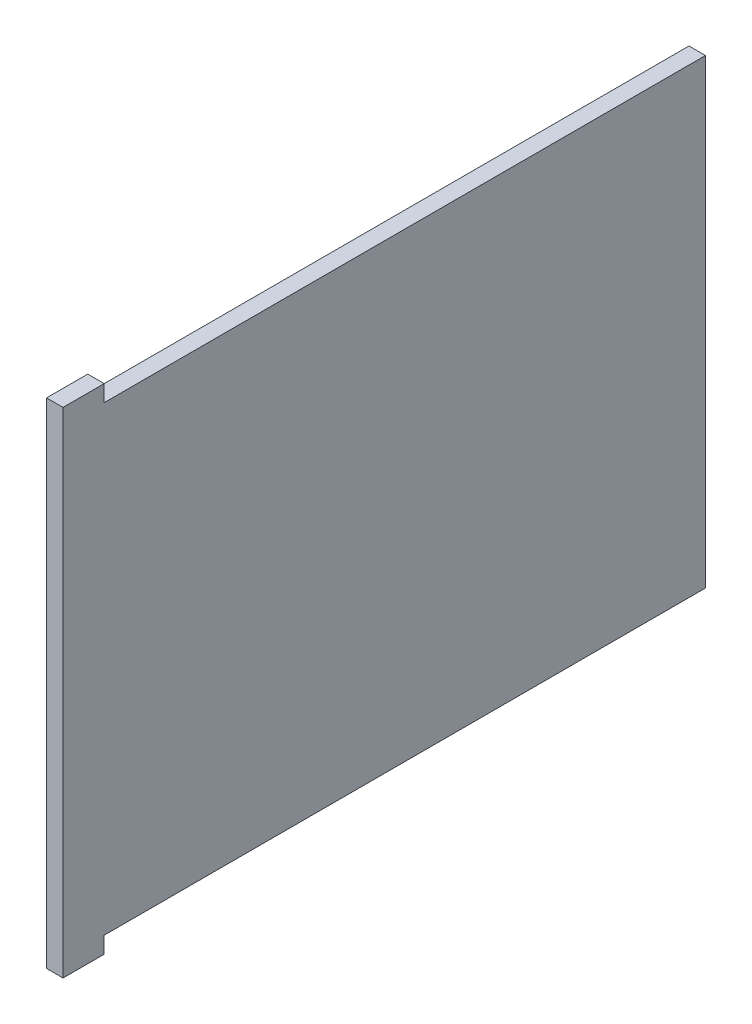
ISO-10303-21;
HEADER;
FILE_DESCRIPTION(('STEP AP214'),'2;1');
FILE_NAME('part.step','',(''),(''),'','','');
FILE_SCHEMA(('AUTOMOTIVE_DESIGN { 1 0 10303 214 1 1 1 1 }'));
ENDSEC;
DATA;
#1=APPLICATION_CONTEXT('core data for automotive mechanical design processes');
#2=APPLICATION_PROTOCOL_DEFINITION('international standard','automotive_design',2000,#1);
#3=PRODUCT_CONTEXT('',#1,'mechanical');
#4=PRODUCT('Part','Part','',(#3));
#5=PRODUCT_RELATED_PRODUCT_CATEGORY('part','',(#4));
#6=PRODUCT_DEFINITION_FORMATION('','',#4);
#7=PRODUCT_DEFINITION_CONTEXT('part definition',#1,'design');
#8=PRODUCT_DEFINITION('design','',#6,#7);
#9=PRODUCT_DEFINITION_SHAPE('','',#8);
#10=(LENGTH_UNIT() NAMED_UNIT(*) SI_UNIT(.MILLI.,.METRE.));
#11=(NAMED_UNIT(*) PLANE_ANGLE_UNIT() SI_UNIT($,.RADIAN.));
#12=(NAMED_UNIT(*) SI_UNIT($,.STERADIAN.) SOLID_ANGLE_UNIT());
#13=UNCERTAINTY_MEASURE_WITH_UNIT(LENGTH_MEASURE(1.E-05),#10,'distance_accuracy_value','');
#14=(GEOMETRIC_REPRESENTATION_CONTEXT(3) GLOBAL_UNCERTAINTY_ASSIGNED_CONTEXT((#13)) GLOBAL_UNIT_ASSIGNED_CONTEXT((#10,
#11,#12)) REPRESENTATION_CONTEXT('',''));
#15=CARTESIAN_POINT('',(0.,0.,0.));
#16=DIRECTION('',(0.,0.,1.));
#17=DIRECTION('',(1.,0.,0.));
#18=AXIS2_PLACEMENT_3D('',#15,#16,#17);
#19=CARTESIAN_POINT('',(2.,0.,0.));
#20=DIRECTION('',(0.,1.,0.));
#21=DIRECTION('',(0.,0.,1.));
#22=AXIS2_PLACEMENT_3D('',#19,#20,#21);
#23=PLANE('',#22);
#24=DIRECTION('',(0.,0.,-1.));
#25=VECTOR('',#24,1.);
#26=CARTESIAN_POINT('',(0.,0.,0.));
#27=LINE('',#26,#25);
#28=CARTESIAN_POINT('',(0.,0.,0.));
#29=VERTEX_POINT('',#28);
#30=CARTESIAN_POINT('',(0.,0.,-5.));
#31=VERTEX_POINT('',#30);
#32=EDGE_CURVE('E137',#29,#31,#27,.T.);
#33=ORIENTED_EDGE('',*,*,#32,.T.);
#34=DIRECTION('',(-1.,0.,0.));
#35=VECTOR('',#34,1.);
#36=CARTESIAN_POINT('',(2.,0.,-5.));
#37=LINE('',#36,#35);
#38=CARTESIAN_POINT('',(2.,0.,-5.));
#39=VERTEX_POINT('',#38);
#40=EDGE_CURVE('E11',#39,#31,#37,.T.);
#41=ORIENTED_EDGE('',*,*,#40,.F.);
#42=DIRECTION('',(0.,0.,-1.));
#43=VECTOR('',#42,1.);
#44=CARTESIAN_POINT('',(2.,0.,0.));
#45=LINE('',#44,#43);
#46=CARTESIAN_POINT('',(2.,0.,0.));
#47=VERTEX_POINT('',#46);
#48=EDGE_CURVE('E157',#47,#39,#45,.T.);
#49=ORIENTED_EDGE('',*,*,#48,.F.);
#50=DIRECTION('',(-1.,0.,0.));
#51=VECTOR('',#50,1.);
#52=CARTESIAN_POINT('',(2.,0.,0.));
#53=LINE('',#52,#51);
#54=EDGE_CURVE('E57',#47,#29,#53,.T.);
#55=ORIENTED_EDGE('',*,*,#54,.T.);
#56=EDGE_LOOP('',(#33,#41,#49,#55));
#57=FACE_BOUND('',#56,.T.);
#58=ADVANCED_FACE('F41',(#57),#23,.F.);
#59=CARTESIAN_POINT('',(2.,0.,-5.));
#60=DIRECTION('',(0.,0.,1.));
#61=DIRECTION('',(0.,-1.,0.));
#62=AXIS2_PLACEMENT_3D('',#59,#60,#61);
#63=PLANE('',#62);
#64=DIRECTION('',(0.,1.,0.));
#65=VECTOR('',#64,1.);
#66=CARTESIAN_POINT('',(0.,0.,-5.));
#67=LINE('',#66,#65);
#68=CARTESIAN_POINT('',(0.,1.99999999999999,-5.));
#69=VERTEX_POINT('',#68);
#70=EDGE_CURVE('E139',#31,#69,#67,.T.);
#71=ORIENTED_EDGE('',*,*,#70,.T.);
#72=DIRECTION('',(-1.,0.,0.));
#73=VECTOR('',#72,1.);
#74=CARTESIAN_POINT('',(2.,1.99999999999999,-5.));
#75=LINE('',#74,#73);
#76=CARTESIAN_POINT('',(2.,1.99999999999999,-5.));
#77=VERTEX_POINT('',#76);
#78=EDGE_CURVE('E49',#77,#69,#75,.T.);
#79=ORIENTED_EDGE('',*,*,#78,.F.);
#80=DIRECTION('',(0.,1.,0.));
#81=VECTOR('',#80,1.);
#82=CARTESIAN_POINT('',(2.,0.,-5.));
#83=LINE('',#82,#81);
#84=EDGE_CURVE('E95',#39,#77,#83,.T.);
#85=ORIENTED_EDGE('',*,*,#84,.F.);
#86=ORIENTED_EDGE('',*,*,#40,.T.);
#87=EDGE_LOOP('',(#71,#79,#85,#86));
#88=FACE_BOUND('',#87,.T.);
#89=ADVANCED_FACE('F170',(#88),#63,.F.);
#90=CARTESIAN_POINT('',(2.,1.99999999999999,0.));
#91=DIRECTION('',(0.,-1.,0.));
#92=DIRECTION('',(0.,0.,-1.));
#93=AXIS2_PLACEMENT_3D('',#90,#91,#92);
#94=PLANE('',#93);
#95=DIRECTION('',(0.,0.,1.));
#96=VECTOR('',#95,1.);
#97=CARTESIAN_POINT('',(0.,1.99999999999999,0.));
#98=LINE('',#97,#96);
#99=CARTESIAN_POINT('',(0.,2.,-78.));
#100=VERTEX_POINT('',#99);
#101=EDGE_CURVE('E142',#100,#69,#98,.T.);
#102=ORIENTED_EDGE('',*,*,#101,.F.);
#103=DIRECTION('',(-1.,0.,0.));
#104=VECTOR('',#103,1.);
#105=CARTESIAN_POINT('',(2.,2.,-78.));
#106=LINE('',#105,#104);
#107=CARTESIAN_POINT('',(2.,2.,-78.));
#108=VERTEX_POINT('',#107);
#109=EDGE_CURVE('E163',#108,#100,#106,.T.);
#110=ORIENTED_EDGE('',*,*,#109,.F.);
#111=DIRECTION('',(0.,0.,1.));
#112=VECTOR('',#111,1.);
#113=CARTESIAN_POINT('',(2.,1.99999999999999,0.));
#114=LINE('',#113,#112);
#115=EDGE_CURVE('E169',#108,#77,#114,.T.);
#116=ORIENTED_EDGE('',*,*,#115,.T.);
#117=ORIENTED_EDGE('',*,*,#78,.T.);
#118=EDGE_LOOP('',(#102,#110,#116,#117));
#119=FACE_BOUND('',#118,.T.);
#120=ADVANCED_FACE('F167',(#119),#94,.T.);
#121=CARTESIAN_POINT('',(2.,0.,-78.));
#122=DIRECTION('',(0.,0.,1.));
#123=DIRECTION('',(1.,0.,0.));
#124=AXIS2_PLACEMENT_3D('',#121,#122,#123);
#125=PLANE('',#124);
#126=DIRECTION('',(0.,1.,0.));
#127=VECTOR('',#126,1.);
#128=CARTESIAN_POINT('',(0.,0.,-78.));
#129=LINE('',#128,#127);
#130=CARTESIAN_POINT('',(0.,58.,-78.));
#131=VERTEX_POINT('',#130);
#132=EDGE_CURVE('E145',#100,#131,#129,.T.);
#133=ORIENTED_EDGE('',*,*,#132,.T.);
#134=DIRECTION('',(-1.,0.,0.));
#135=VECTOR('',#134,1.);
#136=CARTESIAN_POINT('',(2.,58.,-78.));
#137=LINE('',#136,#135);
#138=CARTESIAN_POINT('',(2.,58.,-78.));
#139=VERTEX_POINT('',#138);
#140=EDGE_CURVE('E161',#139,#131,#137,.T.);
#141=ORIENTED_EDGE('',*,*,#140,.F.);
#142=DIRECTION('',(0.,1.,0.));
#143=VECTOR('',#142,1.);
#144=CARTESIAN_POINT('',(2.,0.,-78.));
#145=LINE('',#144,#143);
#146=EDGE_CURVE('E180',#108,#139,#145,.T.);
#147=ORIENTED_EDGE('',*,*,#146,.F.);
#148=ORIENTED_EDGE('',*,*,#109,.T.);
#149=EDGE_LOOP('',(#133,#141,#147,#148));
#150=FACE_BOUND('',#149,.T.);
#151=ADVANCED_FACE('F178',(#150),#125,.F.);
#152=CARTESIAN_POINT('',(2.,58.,0.));
#153=DIRECTION('',(0.,1.,0.));
#154=DIRECTION('',(0.,0.,1.));
#155=AXIS2_PLACEMENT_3D('',#152,#153,#154);
#156=PLANE('',#155);
#157=DIRECTION('',(0.,0.,-1.));
#158=VECTOR('',#157,1.);
#159=CARTESIAN_POINT('',(0.,58.,0.));
#160=LINE('',#159,#158);
#161=CARTESIAN_POINT('',(0.,58.,-5.));
#162=VERTEX_POINT('',#161);
#163=EDGE_CURVE('E148',#162,#131,#160,.T.);
#164=ORIENTED_EDGE('',*,*,#163,.F.);
#165=DIRECTION('',(-1.,0.,0.));
#166=VECTOR('',#165,1.);
#167=CARTESIAN_POINT('',(2.,58.,-5.));
#168=LINE('',#167,#166);
#169=CARTESIAN_POINT('',(2.,58.,-5.));
#170=VERTEX_POINT('',#169);
#171=EDGE_CURVE('E120',#170,#162,#168,.T.);
#172=ORIENTED_EDGE('',*,*,#171,.F.);
#173=DIRECTION('',(0.,0.,-1.));
#174=VECTOR('',#173,1.);
#175=CARTESIAN_POINT('',(2.,58.,0.));
#176=LINE('',#175,#174);
#177=EDGE_CURVE('E129',#170,#139,#176,.T.);
#178=ORIENTED_EDGE('',*,*,#177,.T.);
#179=ORIENTED_EDGE('',*,*,#140,.T.);
#180=EDGE_LOOP('',(#164,#172,#178,#179));
#181=FACE_BOUND('',#180,.T.);
#182=ADVANCED_FACE('F186',(#181),#156,.T.);
#183=CARTESIAN_POINT('',(2.,0.,-5.00000000000003));
#184=DIRECTION('',(0.,0.,-1.));
#185=DIRECTION('',(0.,1.,0.));
#186=AXIS2_PLACEMENT_3D('',#183,#184,#185);
#187=PLANE('',#186);
#188=DIRECTION('',(0.,-1.,0.));
#189=VECTOR('',#188,1.);
#190=CARTESIAN_POINT('',(0.,0.,-5.00000000000003));
#191=LINE('',#190,#189);
#192=CARTESIAN_POINT('',(0.,60.,-5.));
#193=VERTEX_POINT('',#192);
#194=EDGE_CURVE('E116',#193,#162,#191,.T.);
#195=ORIENTED_EDGE('',*,*,#194,.F.);
#196=DIRECTION('',(-1.,0.,0.));
#197=VECTOR('',#196,1.);
#198=CARTESIAN_POINT('',(2.,60.,-5.));
#199=LINE('',#198,#197);
#200=CARTESIAN_POINT('',(2.,60.,-5.));
#201=VERTEX_POINT('',#200);
#202=EDGE_CURVE('E111',#201,#193,#199,.T.);
#203=ORIENTED_EDGE('',*,*,#202,.F.);
#204=DIRECTION('',(0.,-1.,0.));
#205=VECTOR('',#204,1.);
#206=CARTESIAN_POINT('',(2.,0.,-5.00000000000003));
#207=LINE('',#206,#205);
#208=EDGE_CURVE('E114',#201,#170,#207,.T.);
#209=ORIENTED_EDGE('',*,*,#208,.T.);
#210=ORIENTED_EDGE('',*,*,#171,.T.);
#211=EDGE_LOOP('',(#195,#203,#209,#210));
#212=FACE_BOUND('',#211,.T.);
#213=ADVANCED_FACE('F113',(#212),#187,.T.);
#214=CARTESIAN_POINT('',(2.,60.,0.));
#215=DIRECTION('',(0.,1.,0.));
#216=DIRECTION('',(0.,0.,1.));
#217=AXIS2_PLACEMENT_3D('',#214,#215,#216);
#218=PLANE('',#217);
#219=DIRECTION('',(0.,0.,-1.));
#220=VECTOR('',#219,1.);
#221=CARTESIAN_POINT('',(0.,60.,0.));
#222=LINE('',#221,#220);
#223=CARTESIAN_POINT('',(0.,60.,0.));
#224=VERTEX_POINT('',#223);
#225=EDGE_CURVE('E152',#224,#193,#222,.T.);
#226=ORIENTED_EDGE('',*,*,#225,.F.);
#227=DIRECTION('',(-1.,0.,0.));
#228=VECTOR('',#227,1.);
#229=CARTESIAN_POINT('',(2.,60.,0.));
#230=LINE('',#229,#228);
#231=CARTESIAN_POINT('',(2.,60.,0.));
#232=VERTEX_POINT('',#231);
#233=EDGE_CURVE('E83',#232,#224,#230,.T.);
#234=ORIENTED_EDGE('',*,*,#233,.F.);
#235=DIRECTION('',(0.,0.,-1.));
#236=VECTOR('',#235,1.);
#237=CARTESIAN_POINT('',(2.,60.,0.));
#238=LINE('',#237,#236);
#239=EDGE_CURVE('E127',#232,#201,#238,.T.);
#240=ORIENTED_EDGE('',*,*,#239,.T.);
#241=ORIENTED_EDGE('',*,*,#202,.T.);
#242=EDGE_LOOP('',(#226,#234,#240,#241));
#243=FACE_BOUND('',#242,.T.);
#244=ADVANCED_FACE('F131',(#243),#218,.T.);
#245=CARTESIAN_POINT('',(2.,0.,0.));
#246=DIRECTION('',(0.,0.,1.));
#247=DIRECTION('',(1.,0.,0.));
#248=AXIS2_PLACEMENT_3D('',#245,#246,#247);
#249=PLANE('',#248);
#250=DIRECTION('',(0.,1.,0.));
#251=VECTOR('',#250,1.);
#252=CARTESIAN_POINT('',(0.,0.,0.));
#253=LINE('',#252,#251);
#254=EDGE_CURVE('E154',#29,#224,#253,.T.);
#255=ORIENTED_EDGE('',*,*,#254,.F.);
#256=ORIENTED_EDGE('',*,*,#54,.F.);
#257=DIRECTION('',(0.,1.,0.));
#258=VECTOR('',#257,1.);
#259=CARTESIAN_POINT('',(2.,0.,0.));
#260=LINE('',#259,#258);
#261=EDGE_CURVE('E132',#47,#232,#260,.T.);
#262=ORIENTED_EDGE('',*,*,#261,.T.);
#263=ORIENTED_EDGE('',*,*,#233,.T.);
#264=EDGE_LOOP('',(#255,#256,#262,#263));
#265=FACE_BOUND('',#264,.T.);
#266=ADVANCED_FACE('F187',(#265),#249,.T.);
#267=CARTESIAN_POINT('',(2.,0.,0.));
#268=DIRECTION('',(1.,0.,0.));
#269=DIRECTION('',(0.,0.,-1.));
#270=AXIS2_PLACEMENT_3D('',#267,#268,#269);
#271=PLANE('',#270);
#272=ORIENTED_EDGE('',*,*,#48,.T.);
#273=ORIENTED_EDGE('',*,*,#84,.T.);
#274=ORIENTED_EDGE('',*,*,#115,.F.);
#275=ORIENTED_EDGE('',*,*,#146,.T.);
#276=ORIENTED_EDGE('',*,*,#177,.F.);
#277=ORIENTED_EDGE('',*,*,#208,.F.);
#278=ORIENTED_EDGE('',*,*,#239,.F.);
#279=ORIENTED_EDGE('',*,*,#261,.F.);
#280=EDGE_LOOP('',(#272,#273,#274,#275,#276,#277,#278,#279));
#281=FACE_BOUND('',#280,.T.);
#282=ADVANCED_FACE('F125',(#281),#271,.T.);
#283=CARTESIAN_POINT('',(0.,0.,0.));
#284=DIRECTION('',(1.,0.,0.));
#285=DIRECTION('',(0.,0.,-1.));
#286=AXIS2_PLACEMENT_3D('',#283,#284,#285);
#287=PLANE('',#286);
#288=ORIENTED_EDGE('',*,*,#32,.F.);
#289=ORIENTED_EDGE('',*,*,#254,.T.);
#290=ORIENTED_EDGE('',*,*,#225,.T.);
#291=ORIENTED_EDGE('',*,*,#194,.T.);
#292=ORIENTED_EDGE('',*,*,#163,.T.);
#293=ORIENTED_EDGE('',*,*,#132,.F.);
#294=ORIENTED_EDGE('',*,*,#101,.T.);
#295=ORIENTED_EDGE('',*,*,#70,.F.);
#296=EDGE_LOOP('',(#288,#289,#290,#291,#292,#293,#294,#295));
#297=FACE_BOUND('',#296,.T.);
#298=ADVANCED_FACE('F174',(#297),#287,.F.);
#299=CLOSED_SHELL('',(#58,#89,#120,#151,#182,#213,#244,#266,#282,#298));
#300=MANIFOLD_SOLID_BREP('B2',#299);
#301=ADVANCED_BREP_SHAPE_REPRESENTATION('',(#18,#300),#14);
#302=SHAPE_DEFINITION_REPRESENTATION(#9,#301);
ENDSEC;
END-ISO-10303-21;
